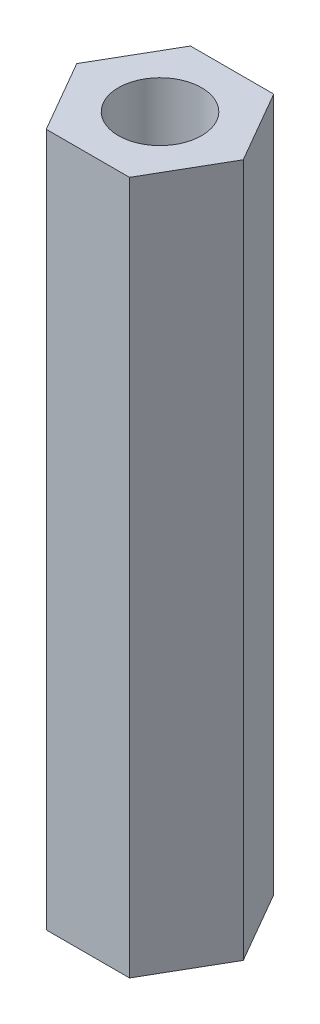
ISO-10303-21;
HEADER;
FILE_DESCRIPTION(('STEP AP214'),'2;1');
FILE_NAME('part.step','',(''),(''),'','','');
FILE_SCHEMA(('AUTOMOTIVE_DESIGN { 1 0 10303 214 1 1 1 1 }'));
ENDSEC;
DATA;
#1=APPLICATION_CONTEXT('core data for automotive mechanical design processes');
#2=APPLICATION_PROTOCOL_DEFINITION('international standard','automotive_design',2000,#1);
#3=PRODUCT_CONTEXT('',#1,'mechanical');
#4=PRODUCT('Part','Part','',(#3));
#5=PRODUCT_RELATED_PRODUCT_CATEGORY('part','',(#4));
#6=PRODUCT_DEFINITION_FORMATION('','',#4);
#7=PRODUCT_DEFINITION_CONTEXT('part definition',#1,'design');
#8=PRODUCT_DEFINITION('design','',#6,#7);
#9=PRODUCT_DEFINITION_SHAPE('','',#8);
#10=(LENGTH_UNIT() NAMED_UNIT(*) SI_UNIT(.MILLI.,.METRE.));
#11=(NAMED_UNIT(*) PLANE_ANGLE_UNIT() SI_UNIT($,.RADIAN.));
#12=(NAMED_UNIT(*) SI_UNIT($,.STERADIAN.) SOLID_ANGLE_UNIT());
#13=UNCERTAINTY_MEASURE_WITH_UNIT(LENGTH_MEASURE(1.E-05),#10,'distance_accuracy_value','');
#14=(GEOMETRIC_REPRESENTATION_CONTEXT(3) GLOBAL_UNCERTAINTY_ASSIGNED_CONTEXT((#13)) GLOBAL_UNIT_ASSIGNED_CONTEXT((#10,
#11,#12)) REPRESENTATION_CONTEXT('',''));
#15=CARTESIAN_POINT('',(0.,0.,0.));
#16=DIRECTION('',(0.,0.,1.));
#17=DIRECTION('',(1.,0.,0.));
#18=AXIS2_PLACEMENT_3D('',#15,#16,#17);
#19=CARTESIAN_POINT('',(0.,25.,0.));
#20=DIRECTION('',(0.,1.,0.));
#21=DIRECTION('',(0.,0.,1.));
#22=AXIS2_PLACEMENT_3D('',#19,#20,#21);
#23=PLANE('',#22);
#24=DIRECTION('',(0.5,0.,-0.866025403784439));
#25=VECTOR('',#24,1.);
#26=CARTESIAN_POINT('',(1.50111069989303,25.,2.6));
#27=LINE('',#26,#25);
#28=CARTESIAN_POINT('',(1.50111069989303,25.,2.6));
#29=VERTEX_POINT('',#28);
#30=CARTESIAN_POINT('',(3.00222139978605,25.,0.));
#31=VERTEX_POINT('',#30);
#32=EDGE_CURVE('E132',#29,#31,#27,.T.);
#33=ORIENTED_EDGE('',*,*,#32,.T.);
#34=DIRECTION('',(-0.5,0.,-0.866025403784438));
#35=VECTOR('',#34,1.);
#36=CARTESIAN_POINT('',(3.00222139978605,25.,0.));
#37=LINE('',#36,#35);
#38=CARTESIAN_POINT('',(1.50111069989303,25.,-2.6));
#39=VERTEX_POINT('',#38);
#40=EDGE_CURVE('E90',#31,#39,#37,.T.);
#41=ORIENTED_EDGE('',*,*,#40,.T.);
#42=DIRECTION('',(-1.,0.,0.));
#43=VECTOR('',#42,1.);
#44=CARTESIAN_POINT('',(1.50111069989303,25.,-2.6));
#45=LINE('',#44,#43);
#46=CARTESIAN_POINT('',(-1.50111069989303,25.,-2.6));
#47=VERTEX_POINT('',#46);
#48=EDGE_CURVE('E103',#39,#47,#45,.T.);
#49=ORIENTED_EDGE('',*,*,#48,.T.);
#50=DIRECTION('',(-0.5,0.,0.866025403784439));
#51=VECTOR('',#50,1.);
#52=CARTESIAN_POINT('',(-1.50111069989303,25.,-2.6));
#53=LINE('',#52,#51);
#54=CARTESIAN_POINT('',(-3.00222139978605,25.,0.));
#55=VERTEX_POINT('',#54);
#56=EDGE_CURVE('E97',#47,#55,#53,.T.);
#57=ORIENTED_EDGE('',*,*,#56,.T.);
#58=DIRECTION('',(0.5,0.,0.866025403784439));
#59=VECTOR('',#58,1.);
#60=CARTESIAN_POINT('',(-3.00222139978605,25.,0.));
#61=LINE('',#60,#59);
#62=CARTESIAN_POINT('',(-1.50111069989303,25.,2.6));
#63=VERTEX_POINT('',#62);
#64=EDGE_CURVE('E101',#55,#63,#61,.T.);
#65=ORIENTED_EDGE('',*,*,#64,.T.);
#66=DIRECTION('',(1.,0.,0.));
#67=VECTOR('',#66,1.);
#68=CARTESIAN_POINT('',(-1.50111069989303,25.,2.6));
#69=LINE('',#68,#67);
#70=EDGE_CURVE('E53',#63,#29,#69,.T.);
#71=ORIENTED_EDGE('',*,*,#70,.T.);
#72=EDGE_LOOP('',(#33,#41,#49,#57,#65,#71));
#73=FACE_BOUND('',#72,.T.);
#74=CARTESIAN_POINT('',(0.,25.,0.));
#75=DIRECTION('',(0.,1.,0.));
#76=DIRECTION('',(0.,0.,1.));
#77=AXIS2_PLACEMENT_3D('',#74,#75,#76);
#78=CIRCLE('',#77,1.5);
#79=CARTESIAN_POINT('',(0.,25.,1.5));
#80=VERTEX_POINT('',#79);
#81=EDGE_CURVE('E125',#80,#80,#78,.T.);
#82=ORIENTED_EDGE('',*,*,#81,.F.);
#83=EDGE_LOOP('',(#82));
#84=FACE_BOUND('',#83,.T.);
#85=ADVANCED_FACE('F36',(#73,#84),#23,.T.);
#86=CARTESIAN_POINT('',(0.,0.,0.));
#87=DIRECTION('',(0.,1.,0.));
#88=DIRECTION('',(0.,0.,1.));
#89=AXIS2_PLACEMENT_3D('',#86,#87,#88);
#90=PLANE('',#89);
#91=DIRECTION('',(0.5,0.,-0.866025403784439));
#92=VECTOR('',#91,1.);
#93=CARTESIAN_POINT('',(1.50111069989303,0.,2.6));
#94=LINE('',#93,#92);
#95=CARTESIAN_POINT('',(1.50111069989303,0.,2.6));
#96=VERTEX_POINT('',#95);
#97=CARTESIAN_POINT('',(3.00222139978605,0.,0.));
#98=VERTEX_POINT('',#97);
#99=EDGE_CURVE('E121',#96,#98,#94,.T.);
#100=ORIENTED_EDGE('',*,*,#99,.F.);
#101=DIRECTION('',(1.,0.,0.));
#102=VECTOR('',#101,1.);
#103=CARTESIAN_POINT('',(-1.50111069989303,0.,2.6));
#104=LINE('',#103,#102);
#105=CARTESIAN_POINT('',(-1.50111069989303,0.,2.6));
#106=VERTEX_POINT('',#105);
#107=EDGE_CURVE('E82',#106,#96,#104,.T.);
#108=ORIENTED_EDGE('',*,*,#107,.F.);
#109=DIRECTION('',(0.5,0.,0.866025403784439));
#110=VECTOR('',#109,1.);
#111=CARTESIAN_POINT('',(-3.00222139978605,0.,0.));
#112=LINE('',#111,#110);
#113=CARTESIAN_POINT('',(-3.00222139978605,0.,0.));
#114=VERTEX_POINT('',#113);
#115=EDGE_CURVE('E76',#114,#106,#112,.T.);
#116=ORIENTED_EDGE('',*,*,#115,.F.);
#117=DIRECTION('',(-0.5,0.,0.866025403784439));
#118=VECTOR('',#117,1.);
#119=CARTESIAN_POINT('',(-1.50111069989303,0.,-2.6));
#120=LINE('',#119,#118);
#121=CARTESIAN_POINT('',(-1.50111069989303,0.,-2.6));
#122=VERTEX_POINT('',#121);
#123=EDGE_CURVE('E111',#122,#114,#120,.T.);
#124=ORIENTED_EDGE('',*,*,#123,.F.);
#125=DIRECTION('',(-1.,0.,0.));
#126=VECTOR('',#125,1.);
#127=CARTESIAN_POINT('',(1.50111069989303,0.,-2.6));
#128=LINE('',#127,#126);
#129=CARTESIAN_POINT('',(1.50111069989303,0.,-2.6));
#130=VERTEX_POINT('',#129);
#131=EDGE_CURVE('E127',#130,#122,#128,.T.);
#132=ORIENTED_EDGE('',*,*,#131,.F.);
#133=DIRECTION('',(-0.5,0.,-0.866025403784438));
#134=VECTOR('',#133,1.);
#135=CARTESIAN_POINT('',(3.00222139978605,0.,0.));
#136=LINE('',#135,#134);
#137=EDGE_CURVE('E124',#98,#130,#136,.T.);
#138=ORIENTED_EDGE('',*,*,#137,.F.);
#139=EDGE_LOOP('',(#100,#108,#116,#124,#132,#138));
#140=FACE_BOUND('',#139,.T.);
#141=CARTESIAN_POINT('',(0.,0.,0.));
#142=DIRECTION('',(0.,1.,0.));
#143=DIRECTION('',(0.,0.,1.));
#144=AXIS2_PLACEMENT_3D('',#141,#142,#143);
#145=CIRCLE('',#144,1.5);
#146=CARTESIAN_POINT('',(0.,0.,1.5));
#147=VERTEX_POINT('',#146);
#148=EDGE_CURVE('E225',#147,#147,#145,.T.);
#149=ORIENTED_EDGE('',*,*,#148,.T.);
#150=EDGE_LOOP('',(#149));
#151=FACE_BOUND('',#150,.T.);
#152=ADVANCED_FACE('F141',(#140,#151),#90,.F.);
#153=CARTESIAN_POINT('',(1.50111069989303,25.,2.6));
#154=DIRECTION('',(-0.866025403784439,0.,-0.5));
#155=DIRECTION('',(-0.5,0.,0.866025403784439));
#156=AXIS2_PLACEMENT_3D('',#153,#154,#155);
#157=PLANE('',#156);
#158=ORIENTED_EDGE('',*,*,#99,.T.);
#159=DIRECTION('',(0.,-1.,0.));
#160=VECTOR('',#159,1.);
#161=CARTESIAN_POINT('',(3.00222139978605,25.,0.));
#162=LINE('',#161,#160);
#163=EDGE_CURVE('E11',#31,#98,#162,.T.);
#164=ORIENTED_EDGE('',*,*,#163,.F.);
#165=ORIENTED_EDGE('',*,*,#32,.F.);
#166=DIRECTION('',(0.,-1.,0.));
#167=VECTOR('',#166,1.);
#168=CARTESIAN_POINT('',(1.50111069989303,25.,2.6));
#169=LINE('',#168,#167);
#170=EDGE_CURVE('E117',#29,#96,#169,.T.);
#171=ORIENTED_EDGE('',*,*,#170,.T.);
#172=EDGE_LOOP('',(#158,#164,#165,#171));
#173=FACE_BOUND('',#172,.T.);
#174=ADVANCED_FACE('F38',(#173),#157,.F.);
#175=CARTESIAN_POINT('',(3.00222139978605,25.,0.));
#176=DIRECTION('',(-0.866025403784438,0.,0.5));
#177=DIRECTION('',(0.5,0.,0.866025403784439));
#178=AXIS2_PLACEMENT_3D('',#175,#176,#177);
#179=PLANE('',#178);
#180=ORIENTED_EDGE('',*,*,#137,.T.);
#181=DIRECTION('',(0.,-1.,0.));
#182=VECTOR('',#181,1.);
#183=CARTESIAN_POINT('',(1.50111069989303,25.,-2.6));
#184=LINE('',#183,#182);
#185=EDGE_CURVE('E45',#39,#130,#184,.T.);
#186=ORIENTED_EDGE('',*,*,#185,.F.);
#187=ORIENTED_EDGE('',*,*,#40,.F.);
#188=ORIENTED_EDGE('',*,*,#163,.T.);
#189=EDGE_LOOP('',(#180,#186,#187,#188));
#190=FACE_BOUND('',#189,.T.);
#191=ADVANCED_FACE('F166',(#190),#179,.F.);
#192=CARTESIAN_POINT('',(1.50111069989303,25.,-2.6));
#193=DIRECTION('',(0.,0.,1.));
#194=DIRECTION('',(1.,0.,0.));
#195=AXIS2_PLACEMENT_3D('',#192,#193,#194);
#196=PLANE('',#195);
#197=ORIENTED_EDGE('',*,*,#131,.T.);
#198=DIRECTION('',(0.,-1.,0.));
#199=VECTOR('',#198,1.);
#200=CARTESIAN_POINT('',(-1.50111069989303,25.,-2.6));
#201=LINE('',#200,#199);
#202=EDGE_CURVE('E112',#47,#122,#201,.T.);
#203=ORIENTED_EDGE('',*,*,#202,.F.);
#204=ORIENTED_EDGE('',*,*,#48,.F.);
#205=ORIENTED_EDGE('',*,*,#185,.T.);
#206=EDGE_LOOP('',(#197,#203,#204,#205));
#207=FACE_BOUND('',#206,.T.);
#208=ADVANCED_FACE('F138',(#207),#196,.F.);
#209=CARTESIAN_POINT('',(-1.50111069989303,25.,-2.6));
#210=DIRECTION('',(0.866025403784439,0.,0.5));
#211=DIRECTION('',(0.5,0.,-0.866025403784439));
#212=AXIS2_PLACEMENT_3D('',#209,#210,#211);
#213=PLANE('',#212);
#214=ORIENTED_EDGE('',*,*,#123,.T.);
#215=DIRECTION('',(0.,-1.,0.));
#216=VECTOR('',#215,1.);
#217=CARTESIAN_POINT('',(-3.00222139978605,25.,0.));
#218=LINE('',#217,#216);
#219=EDGE_CURVE('E108',#55,#114,#218,.T.);
#220=ORIENTED_EDGE('',*,*,#219,.F.);
#221=ORIENTED_EDGE('',*,*,#56,.F.);
#222=ORIENTED_EDGE('',*,*,#202,.T.);
#223=EDGE_LOOP('',(#214,#220,#221,#222));
#224=FACE_BOUND('',#223,.T.);
#225=ADVANCED_FACE('F109',(#224),#213,.F.);
#226=CARTESIAN_POINT('',(-3.00222139978605,25.,0.));
#227=DIRECTION('',(0.866025403784439,0.,-0.5));
#228=DIRECTION('',(-0.5,0.,-0.866025403784439));
#229=AXIS2_PLACEMENT_3D('',#226,#227,#228);
#230=PLANE('',#229);
#231=ORIENTED_EDGE('',*,*,#115,.T.);
#232=DIRECTION('',(0.,-1.,0.));
#233=VECTOR('',#232,1.);
#234=CARTESIAN_POINT('',(-1.50111069989303,25.,2.6));
#235=LINE('',#234,#233);
#236=EDGE_CURVE('E113',#63,#106,#235,.T.);
#237=ORIENTED_EDGE('',*,*,#236,.F.);
#238=ORIENTED_EDGE('',*,*,#64,.F.);
#239=ORIENTED_EDGE('',*,*,#219,.T.);
#240=EDGE_LOOP('',(#231,#237,#238,#239));
#241=FACE_BOUND('',#240,.T.);
#242=ADVANCED_FACE('F115',(#241),#230,.F.);
#243=CARTESIAN_POINT('',(-1.50111069989303,25.,2.6));
#244=DIRECTION('',(0.,0.,-1.));
#245=DIRECTION('',(-1.,0.,0.));
#246=AXIS2_PLACEMENT_3D('',#243,#244,#245);
#247=PLANE('',#246);
#248=ORIENTED_EDGE('',*,*,#107,.T.);
#249=ORIENTED_EDGE('',*,*,#170,.F.);
#250=ORIENTED_EDGE('',*,*,#70,.F.);
#251=ORIENTED_EDGE('',*,*,#236,.T.);
#252=EDGE_LOOP('',(#248,#249,#250,#251));
#253=FACE_BOUND('',#252,.T.);
#254=ADVANCED_FACE('F146',(#253),#247,.F.);
#255=CARTESIAN_POINT('',(0.,25.,0.));
#256=DIRECTION('',(0.,-1.,0.));
#257=DIRECTION('',(0.,0.,-1.));
#258=AXIS2_PLACEMENT_3D('',#255,#256,#257);
#259=CYLINDRICAL_SURFACE('',#258,1.5);
#260=ORIENTED_EDGE('',*,*,#81,.T.);
#261=EDGE_LOOP('',(#260));
#262=FACE_BOUND('',#261,.T.);
#263=ORIENTED_EDGE('',*,*,#148,.F.);
#264=EDGE_LOOP('',(#263));
#265=FACE_BOUND('',#264,.T.);
#266=ADVANCED_FACE('F148',(#262,#265),#259,.F.);
#267=CLOSED_SHELL('',(#85,#152,#174,#191,#208,#225,#242,#254,#266));
#268=MANIFOLD_SOLID_BREP('B2',#267);
#269=ADVANCED_BREP_SHAPE_REPRESENTATION('',(#18,#268),#14);
#270=SHAPE_DEFINITION_REPRESENTATION(#9,#269);
ENDSEC;
END-ISO-10303-21;
